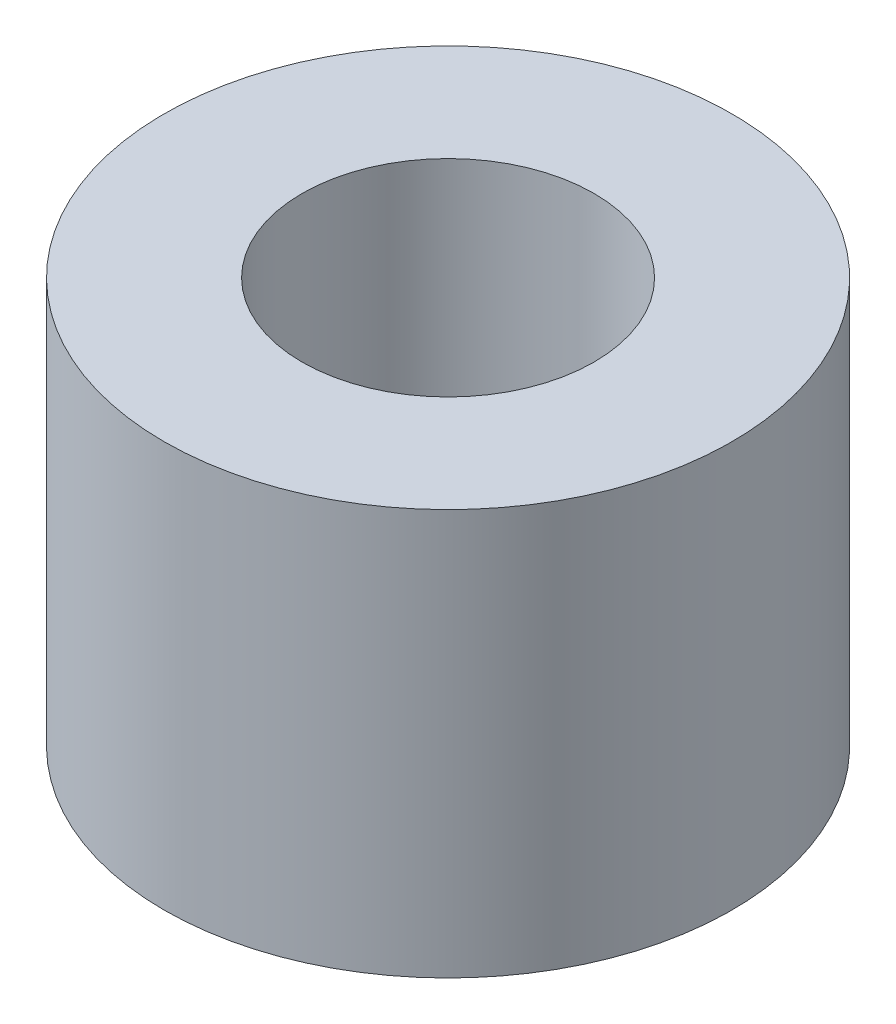
ISO-10303-21;
HEADER;
FILE_DESCRIPTION(('STEP AP214'),'2;1');
FILE_NAME('part.step','',(''),(''),'','','');
FILE_SCHEMA(('AUTOMOTIVE_DESIGN { 1 0 10303 214 1 1 1 1 }'));
ENDSEC;
DATA;
#1=APPLICATION_CONTEXT('core data for automotive mechanical design processes');
#2=APPLICATION_PROTOCOL_DEFINITION('international standard','automotive_design',2000,#1);
#3=PRODUCT_CONTEXT('',#1,'mechanical');
#4=PRODUCT('Part','Part','',(#3));
#5=PRODUCT_RELATED_PRODUCT_CATEGORY('part','',(#4));
#6=PRODUCT_DEFINITION_FORMATION('','',#4);
#7=PRODUCT_DEFINITION_CONTEXT('part definition',#1,'design');
#8=PRODUCT_DEFINITION('design','',#6,#7);
#9=PRODUCT_DEFINITION_SHAPE('','',#8);
#10=(LENGTH_UNIT() NAMED_UNIT(*) SI_UNIT(.MILLI.,.METRE.));
#11=(NAMED_UNIT(*) PLANE_ANGLE_UNIT() SI_UNIT($,.RADIAN.));
#12=(NAMED_UNIT(*) SI_UNIT($,.STERADIAN.) SOLID_ANGLE_UNIT());
#13=UNCERTAINTY_MEASURE_WITH_UNIT(LENGTH_MEASURE(1.E-05),#10,'distance_accuracy_value','');
#14=(GEOMETRIC_REPRESENTATION_CONTEXT(3) GLOBAL_UNCERTAINTY_ASSIGNED_CONTEXT((#13)) GLOBAL_UNIT_ASSIGNED_CONTEXT((#10,
#11,#12)) REPRESENTATION_CONTEXT('',''));
#15=CARTESIAN_POINT('',(0.,0.,0.));
#16=DIRECTION('',(0.,0.,1.));
#17=DIRECTION('',(1.,0.,0.));
#18=AXIS2_PLACEMENT_3D('',#15,#16,#17);
#19=CARTESIAN_POINT('',(0.,2.5,0.));
#20=DIRECTION('',(0.,1.,0.));
#21=DIRECTION('',(0.,0.,1.));
#22=AXIS2_PLACEMENT_3D('',#19,#20,#21);
#23=PLANE('',#22);
#24=CARTESIAN_POINT('',(0.,2.5,0.));
#25=DIRECTION('',(0.,1.,0.));
#26=DIRECTION('',(0.,0.,1.));
#27=AXIS2_PLACEMENT_3D('',#24,#25,#26);
#28=CIRCLE('',#27,3.5);
#29=CARTESIAN_POINT('',(0.,2.5,3.5));
#30=VERTEX_POINT('',#29);
#31=EDGE_CURVE('E10',#30,#30,#28,.T.);
#32=ORIENTED_EDGE('',*,*,#31,.T.);
#33=EDGE_LOOP('',(#32));
#34=FACE_BOUND('',#33,.T.);
#35=CARTESIAN_POINT('',(0.,2.5,0.));
#36=DIRECTION('',(0.,1.,0.));
#37=DIRECTION('',(0.,0.,1.));
#38=AXIS2_PLACEMENT_3D('',#35,#36,#37);
#39=CIRCLE('',#38,1.8);
#40=CARTESIAN_POINT('',(0.,2.5,1.8));
#41=VERTEX_POINT('',#40);
#42=EDGE_CURVE('E43',#41,#41,#39,.T.);
#43=ORIENTED_EDGE('',*,*,#42,.F.);
#44=EDGE_LOOP('',(#43));
#45=FACE_BOUND('',#44,.T.);
#46=ADVANCED_FACE('F32',(#34,#45),#23,.T.);
#47=CARTESIAN_POINT('',(0.,-2.5,0.));
#48=DIRECTION('',(0.,1.,0.));
#49=DIRECTION('',(0.,0.,1.));
#50=AXIS2_PLACEMENT_3D('',#47,#48,#49);
#51=PLANE('',#50);
#52=CARTESIAN_POINT('',(0.,-2.5,0.));
#53=DIRECTION('',(0.,1.,0.));
#54=DIRECTION('',(0.,0.,1.));
#55=AXIS2_PLACEMENT_3D('',#52,#53,#54);
#56=CIRCLE('',#55,3.5);
#57=CARTESIAN_POINT('',(0.,-2.5,3.5));
#58=VERTEX_POINT('',#57);
#59=EDGE_CURVE('E36',#58,#58,#56,.T.);
#60=ORIENTED_EDGE('',*,*,#59,.F.);
#61=EDGE_LOOP('',(#60));
#62=FACE_BOUND('',#61,.T.);
#63=CARTESIAN_POINT('',(0.,-2.5,0.));
#64=DIRECTION('',(0.,1.,0.));
#65=DIRECTION('',(0.,0.,1.));
#66=AXIS2_PLACEMENT_3D('',#63,#64,#65);
#67=CIRCLE('',#66,1.8);
#68=CARTESIAN_POINT('',(0.,-2.5,1.8));
#69=VERTEX_POINT('',#68);
#70=EDGE_CURVE('E45',#69,#69,#67,.T.);
#71=ORIENTED_EDGE('',*,*,#70,.T.);
#72=EDGE_LOOP('',(#71));
#73=FACE_BOUND('',#72,.T.);
#74=ADVANCED_FACE('F55',(#62,#73),#51,.F.);
#75=CARTESIAN_POINT('',(0.,2.5,0.));
#76=DIRECTION('',(0.,-1.,0.));
#77=DIRECTION('',(0.,0.,-1.));
#78=AXIS2_PLACEMENT_3D('',#75,#76,#77);
#79=CYLINDRICAL_SURFACE('',#78,3.5);
#80=ORIENTED_EDGE('',*,*,#31,.F.);
#81=EDGE_LOOP('',(#80));
#82=FACE_BOUND('',#81,.T.);
#83=ORIENTED_EDGE('',*,*,#59,.T.);
#84=EDGE_LOOP('',(#83));
#85=FACE_BOUND('',#84,.T.);
#86=ADVANCED_FACE('F34',(#82,#85),#79,.T.);
#87=CARTESIAN_POINT('',(0.,2.5,0.));
#88=DIRECTION('',(0.,-1.,0.));
#89=DIRECTION('',(0.,0.,-1.));
#90=AXIS2_PLACEMENT_3D('',#87,#88,#89);
#91=CYLINDRICAL_SURFACE('',#90,1.8);
#92=ORIENTED_EDGE('',*,*,#42,.T.);
#93=EDGE_LOOP('',(#92));
#94=FACE_BOUND('',#93,.T.);
#95=ORIENTED_EDGE('',*,*,#70,.F.);
#96=EDGE_LOOP('',(#95));
#97=FACE_BOUND('',#96,.T.);
#98=ADVANCED_FACE('F51',(#94,#97),#91,.F.);
#99=CLOSED_SHELL('',(#46,#74,#86,#98));
#100=MANIFOLD_SOLID_BREP('B2',#99);
#101=ADVANCED_BREP_SHAPE_REPRESENTATION('',(#18,#100),#14);
#102=SHAPE_DEFINITION_REPRESENTATION(#9,#101);
ENDSEC;
END-ISO-10303-21;
